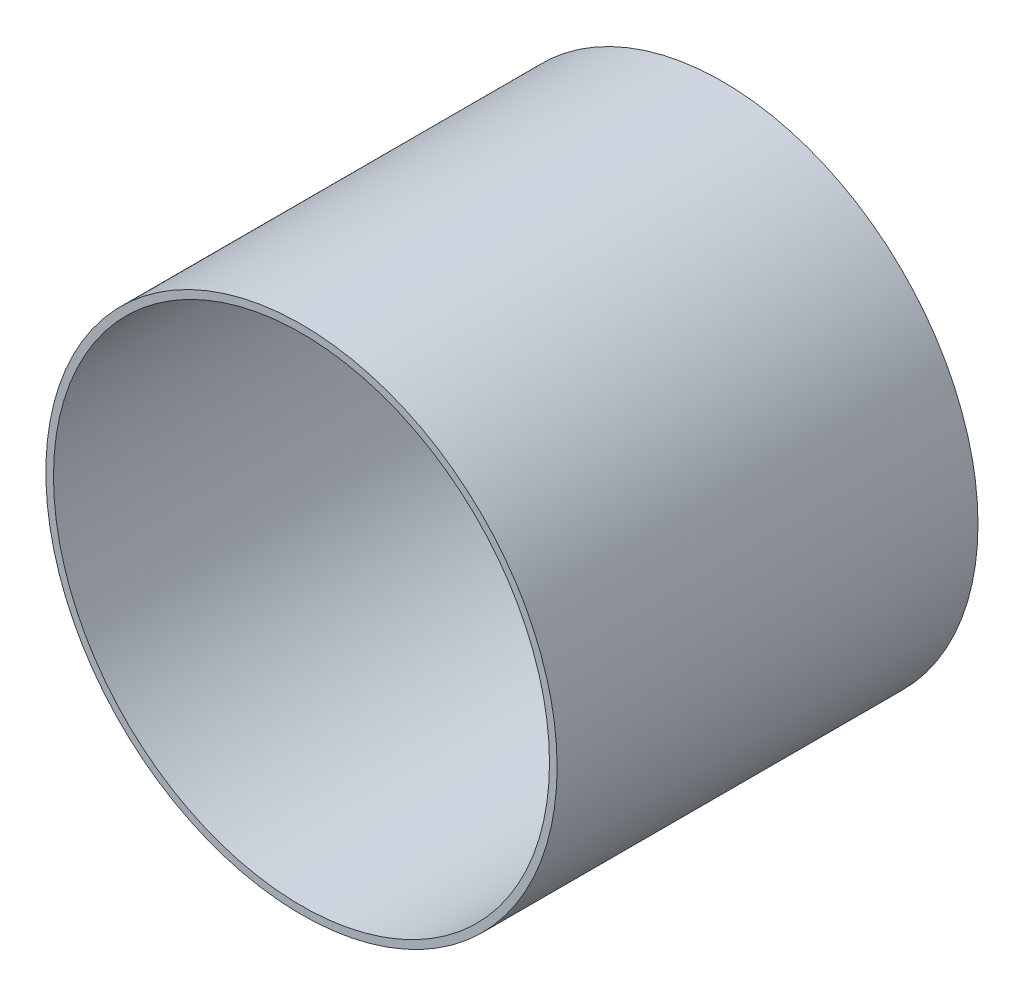
ISO-10303-21;
HEADER;
FILE_DESCRIPTION(('STEP AP214'),'2;1');
FILE_NAME('part.step','',(''),(''),'','','');
FILE_SCHEMA(('AUTOMOTIVE_DESIGN { 1 0 10303 214 1 1 1 1 }'));
ENDSEC;
DATA;
#1=APPLICATION_CONTEXT('core data for automotive mechanical design processes');
#2=APPLICATION_PROTOCOL_DEFINITION('international standard','automotive_design',2000,#1);
#3=PRODUCT_CONTEXT('',#1,'mechanical');
#4=PRODUCT('Part','Part','',(#3));
#5=PRODUCT_RELATED_PRODUCT_CATEGORY('part','',(#4));
#6=PRODUCT_DEFINITION_FORMATION('','',#4);
#7=PRODUCT_DEFINITION_CONTEXT('part definition',#1,'design');
#8=PRODUCT_DEFINITION('design','',#6,#7);
#9=PRODUCT_DEFINITION_SHAPE('','',#8);
#10=(LENGTH_UNIT() NAMED_UNIT(*) SI_UNIT(.MILLI.,.METRE.));
#11=(NAMED_UNIT(*) PLANE_ANGLE_UNIT() SI_UNIT($,.RADIAN.));
#12=(NAMED_UNIT(*) SI_UNIT($,.STERADIAN.) SOLID_ANGLE_UNIT());
#13=UNCERTAINTY_MEASURE_WITH_UNIT(LENGTH_MEASURE(1.E-05),#10,'distance_accuracy_value','');
#14=(GEOMETRIC_REPRESENTATION_CONTEXT(3) GLOBAL_UNCERTAINTY_ASSIGNED_CONTEXT((#13)) GLOBAL_UNIT_ASSIGNED_CONTEXT((#10,
#11,#12)) REPRESENTATION_CONTEXT('',''));
#15=CARTESIAN_POINT('',(0.,0.,0.));
#16=DIRECTION('',(0.,0.,1.));
#17=DIRECTION('',(1.,0.,0.));
#18=AXIS2_PLACEMENT_3D('',#15,#16,#17);
#19=CARTESIAN_POINT('',(0.,0.,0.));
#20=DIRECTION('',(0.,0.,-1.));
#21=DIRECTION('',(1.,0.,0.));
#22=AXIS2_PLACEMENT_3D('',#19,#20,#21);
#23=CYLINDRICAL_SURFACE('',#22,0.85039962);
#24=CARTESIAN_POINT('',(0.,0.,1.39999974));
#25=DIRECTION('',(0.,0.,1.));
#26=DIRECTION('',(1.,0.,0.));
#27=AXIS2_PLACEMENT_3D('',#24,#25,#26);
#28=CIRCLE('',#27,0.85039962);
#29=CARTESIAN_POINT('',(0.85039962,0.,1.39999974));
#30=VERTEX_POINT('',#29);
#31=EDGE_CURVE('E11',#30,#30,#28,.T.);
#32=ORIENTED_EDGE('',*,*,#31,.F.);
#33=DIRECTION('',(0.,0.,1.));
#34=VECTOR('',#33,1.);
#35=CARTESIAN_POINT('',(0.85039962,0.,0.));
#36=LINE('',#35,#34);
#37=CARTESIAN_POINT('',(0.85039962,0.,0.));
#38=VERTEX_POINT('',#37);
#39=EDGE_CURVE('E24',#38,#30,#36,.T.);
#40=ORIENTED_EDGE('',*,*,#39,.F.);
#41=CARTESIAN_POINT('',(0.,0.,0.));
#42=DIRECTION('',(0.,0.,1.));
#43=DIRECTION('',(1.,0.,0.));
#44=AXIS2_PLACEMENT_3D('',#41,#42,#43);
#45=CIRCLE('',#44,0.85039962);
#46=EDGE_CURVE('E46',#38,#38,#45,.T.);
#47=ORIENTED_EDGE('',*,*,#46,.T.);
#48=ORIENTED_EDGE('',*,*,#39,.T.);
#49=EDGE_LOOP('',(#32,#40,#47,#48));
#50=FACE_BOUND('',#49,.T.);
#51=ADVANCED_FACE('F17',(#50),#23,.T.);
#52=CARTESIAN_POINT('',(0.,0.,0.));
#53=DIRECTION('',(0.,0.,-1.));
#54=DIRECTION('',(1.,0.,0.));
#55=AXIS2_PLACEMENT_3D('',#52,#53,#54);
#56=CYLINDRICAL_SURFACE('',#55,0.82499962);
#57=DIRECTION('',(0.,0.,1.));
#58=VECTOR('',#57,1.);
#59=CARTESIAN_POINT('',(0.82499962,0.,0.));
#60=LINE('',#59,#58);
#61=CARTESIAN_POINT('',(0.82499962,0.,0.));
#62=VERTEX_POINT('',#61);
#63=CARTESIAN_POINT('',(0.82499962,0.,1.39999974));
#64=VERTEX_POINT('',#63);
#65=EDGE_CURVE('E40',#62,#64,#60,.T.);
#66=ORIENTED_EDGE('',*,*,#65,.T.);
#67=CARTESIAN_POINT('',(0.,0.,1.39999974));
#68=DIRECTION('',(0.,0.,1.));
#69=DIRECTION('',(1.,0.,0.));
#70=AXIS2_PLACEMENT_3D('',#67,#68,#69);
#71=CIRCLE('',#70,0.82499962);
#72=EDGE_CURVE('E45',#64,#64,#71,.T.);
#73=ORIENTED_EDGE('',*,*,#72,.T.);
#74=ORIENTED_EDGE('',*,*,#65,.F.);
#75=CARTESIAN_POINT('',(0.,0.,0.));
#76=DIRECTION('',(0.,0.,1.));
#77=DIRECTION('',(1.,0.,0.));
#78=AXIS2_PLACEMENT_3D('',#75,#76,#77);
#79=CIRCLE('',#78,0.82499962);
#80=EDGE_CURVE('E43',#62,#62,#79,.T.);
#81=ORIENTED_EDGE('',*,*,#80,.F.);
#82=EDGE_LOOP('',(#66,#73,#74,#81));
#83=FACE_BOUND('',#82,.T.);
#84=ADVANCED_FACE('F42',(#83),#56,.F.);
#85=CARTESIAN_POINT('',(0.85039962,0.,0.));
#86=DIRECTION('',(0.,0.,-1.));
#87=DIRECTION('',(-1.,0.,0.));
#88=AXIS2_PLACEMENT_3D('',#85,#86,#87);
#89=PLANE('',#88);
#90=ORIENTED_EDGE('',*,*,#46,.F.);
#91=EDGE_LOOP('',(#90));
#92=FACE_BOUND('',#91,.T.);
#93=ORIENTED_EDGE('',*,*,#80,.T.);
#94=EDGE_LOOP('',(#93));
#95=FACE_BOUND('',#94,.T.);
#96=ADVANCED_FACE('F49',(#92,#95),#89,.T.);
#97=CARTESIAN_POINT('',(0.85039962,0.,1.39999974));
#98=DIRECTION('',(0.,0.,-1.));
#99=DIRECTION('',(-1.,0.,0.));
#100=AXIS2_PLACEMENT_3D('',#97,#98,#99);
#101=PLANE('',#100);
#102=ORIENTED_EDGE('',*,*,#31,.T.);
#103=EDGE_LOOP('',(#102));
#104=FACE_BOUND('',#103,.T.);
#105=ORIENTED_EDGE('',*,*,#72,.F.);
#106=EDGE_LOOP('',(#105));
#107=FACE_BOUND('',#106,.T.);
#108=ADVANCED_FACE('F56',(#104,#107),#101,.F.);
#109=CLOSED_SHELL('',(#51,#84,#96,#108));
#110=MANIFOLD_SOLID_BREP('B1',#109);
#111=ADVANCED_BREP_SHAPE_REPRESENTATION('',(#18,#110),#14);
#112=SHAPE_DEFINITION_REPRESENTATION(#9,#111);
ENDSEC;
END-ISO-10303-21;
